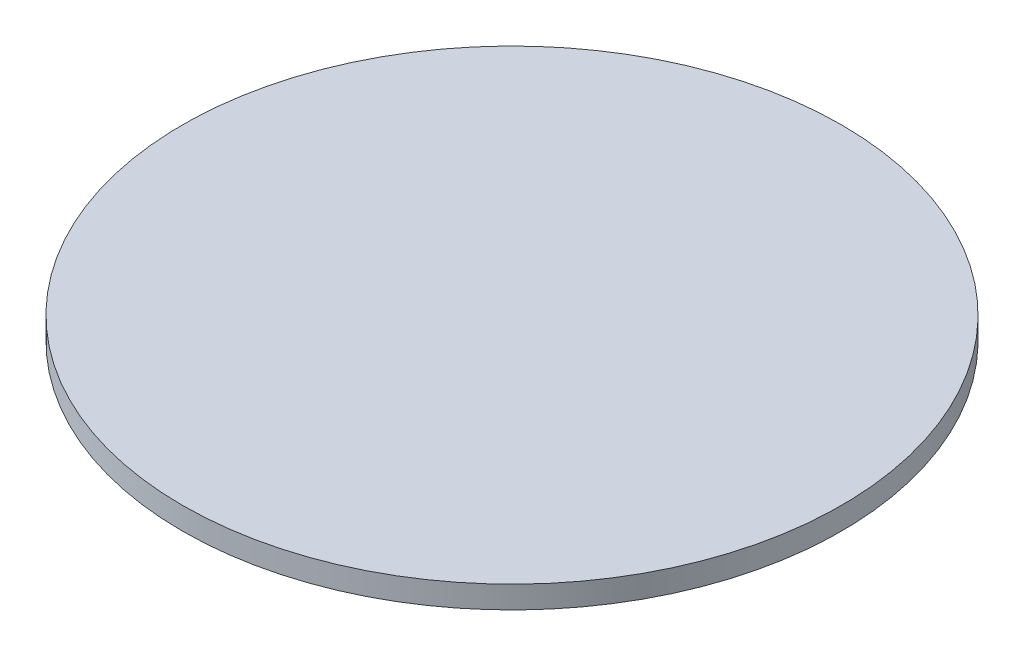
ISO-10303-21;
HEADER;
FILE_DESCRIPTION(('STEP AP214'),'2;1');
FILE_NAME('part.step','',(''),(''),'','','');
FILE_SCHEMA(('AUTOMOTIVE_DESIGN { 1 0 10303 214 1 1 1 1 }'));
ENDSEC;
DATA;
#1=APPLICATION_CONTEXT('core data for automotive mechanical design processes');
#2=APPLICATION_PROTOCOL_DEFINITION('international standard','automotive_design',2000,#1);
#3=PRODUCT_CONTEXT('',#1,'mechanical');
#4=PRODUCT('Part','Part','',(#3));
#5=PRODUCT_RELATED_PRODUCT_CATEGORY('part','',(#4));
#6=PRODUCT_DEFINITION_FORMATION('','',#4);
#7=PRODUCT_DEFINITION_CONTEXT('part definition',#1,'design');
#8=PRODUCT_DEFINITION('design','',#6,#7);
#9=PRODUCT_DEFINITION_SHAPE('','',#8);
#10=(LENGTH_UNIT() NAMED_UNIT(*) SI_UNIT(.MILLI.,.METRE.));
#11=(NAMED_UNIT(*) PLANE_ANGLE_UNIT() SI_UNIT($,.RADIAN.));
#12=(NAMED_UNIT(*) SI_UNIT($,.STERADIAN.) SOLID_ANGLE_UNIT());
#13=UNCERTAINTY_MEASURE_WITH_UNIT(LENGTH_MEASURE(1.E-05),#10,'distance_accuracy_value','');
#14=(GEOMETRIC_REPRESENTATION_CONTEXT(3) GLOBAL_UNCERTAINTY_ASSIGNED_CONTEXT((#13)) GLOBAL_UNIT_ASSIGNED_CONTEXT((#10,
#11,#12)) REPRESENTATION_CONTEXT('',''));
#15=CARTESIAN_POINT('',(0.,0.,0.));
#16=DIRECTION('',(0.,0.,1.));
#17=DIRECTION('',(1.,0.,0.));
#18=AXIS2_PLACEMENT_3D('',#15,#16,#17);
#19=CARTESIAN_POINT('',(0.,3.,0.));
#20=DIRECTION('',(0.,-1.,0.));
#21=DIRECTION('',(0.,0.,-1.));
#22=AXIS2_PLACEMENT_3D('',#19,#20,#21);
#23=CYLINDRICAL_SURFACE('',#22,44.2582485987567);
#24=CARTESIAN_POINT('',(0.,3.,0.));
#25=DIRECTION('',(0.,1.,0.));
#26=DIRECTION('',(0.,0.,1.));
#27=AXIS2_PLACEMENT_3D('',#24,#25,#26);
#28=CIRCLE('',#27,44.2582485987567);
#29=CARTESIAN_POINT('',(0.,3.,44.2582485987567));
#30=VERTEX_POINT('',#29);
#31=EDGE_CURVE('E10',#30,#30,#28,.T.);
#32=ORIENTED_EDGE('',*,*,#31,.F.);
#33=EDGE_LOOP('',(#32));
#34=FACE_BOUND('',#33,.T.);
#35=CARTESIAN_POINT('',(0.,0.,0.));
#36=DIRECTION('',(0.,1.,0.));
#37=DIRECTION('',(0.,0.,1.));
#38=AXIS2_PLACEMENT_3D('',#35,#36,#37);
#39=CIRCLE('',#38,44.2582485987567);
#40=CARTESIAN_POINT('',(0.,0.,44.2582485987567));
#41=VERTEX_POINT('',#40);
#42=EDGE_CURVE('E34',#41,#41,#39,.T.);
#43=ORIENTED_EDGE('',*,*,#42,.T.);
#44=EDGE_LOOP('',(#43));
#45=FACE_BOUND('',#44,.T.);
#46=ADVANCED_FACE('F31',(#34,#45),#23,.T.);
#47=CARTESIAN_POINT('',(0.,3.,0.));
#48=DIRECTION('',(0.,1.,0.));
#49=DIRECTION('',(0.,0.,1.));
#50=AXIS2_PLACEMENT_3D('',#47,#48,#49);
#51=PLANE('',#50);
#52=ORIENTED_EDGE('',*,*,#31,.T.);
#53=EDGE_LOOP('',(#52));
#54=FACE_BOUND('',#53,.T.);
#55=ADVANCED_FACE('F46',(#54),#51,.T.);
#56=CARTESIAN_POINT('',(0.,0.,0.));
#57=DIRECTION('',(0.,1.,0.));
#58=DIRECTION('',(0.,0.,1.));
#59=AXIS2_PLACEMENT_3D('',#56,#57,#58);
#60=PLANE('',#59);
#61=ORIENTED_EDGE('',*,*,#42,.F.);
#62=EDGE_LOOP('',(#61));
#63=FACE_BOUND('',#62,.T.);
#64=ADVANCED_FACE('F44',(#63),#60,.F.);
#65=CLOSED_SHELL('',(#46,#55,#64));
#66=MANIFOLD_SOLID_BREP('B2',#65);
#67=ADVANCED_BREP_SHAPE_REPRESENTATION('',(#18,#66),#14);
#68=SHAPE_DEFINITION_REPRESENTATION(#9,#67);
ENDSEC;
END-ISO-10303-21;
